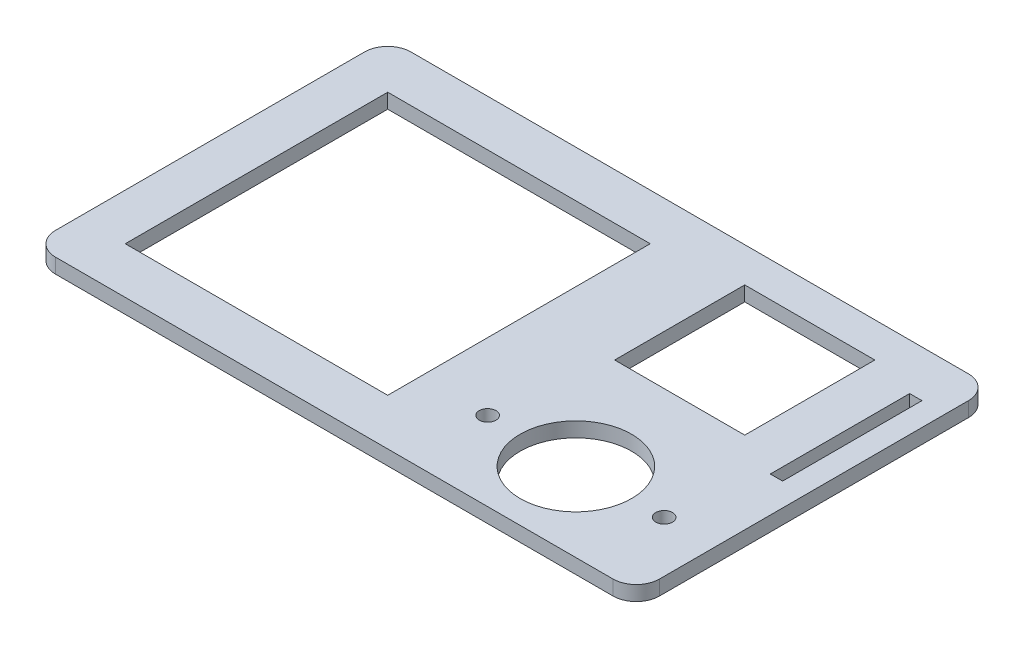
ISO-10303-21;
HEADER;
FILE_DESCRIPTION(('STEP AP214'),'2;1');
FILE_NAME('part.step','',(''),(''),'','','');
FILE_SCHEMA(('AUTOMOTIVE_DESIGN { 1 0 10303 214 1 1 1 1 }'));
ENDSEC;
DATA;
#1=APPLICATION_CONTEXT('core data for automotive mechanical design processes');
#2=APPLICATION_PROTOCOL_DEFINITION('international standard','automotive_design',2000,#1);
#3=PRODUCT_CONTEXT('',#1,'mechanical');
#4=PRODUCT('Part','Part','',(#3));
#5=PRODUCT_RELATED_PRODUCT_CATEGORY('part','',(#4));
#6=PRODUCT_DEFINITION_FORMATION('','',#4);
#7=PRODUCT_DEFINITION_CONTEXT('part definition',#1,'design');
#8=PRODUCT_DEFINITION('design','',#6,#7);
#9=PRODUCT_DEFINITION_SHAPE('','',#8);
#10=(LENGTH_UNIT() NAMED_UNIT(*) SI_UNIT(.MILLI.,.METRE.));
#11=(NAMED_UNIT(*) PLANE_ANGLE_UNIT() SI_UNIT($,.RADIAN.));
#12=(NAMED_UNIT(*) SI_UNIT($,.STERADIAN.) SOLID_ANGLE_UNIT());
#13=UNCERTAINTY_MEASURE_WITH_UNIT(LENGTH_MEASURE(1.E-05),#10,'distance_accuracy_value','');
#14=(GEOMETRIC_REPRESENTATION_CONTEXT(3) GLOBAL_UNCERTAINTY_ASSIGNED_CONTEXT((#13)) GLOBAL_UNIT_ASSIGNED_CONTEXT((#10,
#11,#12)) REPRESENTATION_CONTEXT('',''));
#15=CARTESIAN_POINT('',(0.,0.,0.));
#16=DIRECTION('',(0.,0.,1.));
#17=DIRECTION('',(1.,0.,0.));
#18=AXIS2_PLACEMENT_3D('',#15,#16,#17);
#19=CARTESIAN_POINT('',(0.,3.175,0.));
#20=DIRECTION('',(0.,-1.,0.));
#21=DIRECTION('',(0.,0.,-1.));
#22=AXIS2_PLACEMENT_3D('',#19,#20,#21);
#23=PLANE('',#22);
#24=CARTESIAN_POINT('',(81.,3.175,-17.));
#25=DIRECTION('',(0.,1.,0.));
#26=DIRECTION('',(0.,0.,-1.));
#27=AXIS2_PLACEMENT_3D('',#24,#25,#26);
#28=CIRCLE('',#27,1.79999999999999);
#29=CARTESIAN_POINT('',(81.,3.175,-18.8));
#30=VERTEX_POINT('',#29);
#31=EDGE_CURVE('E234',#30,#30,#28,.T.);
#32=ORIENTED_EDGE('',*,*,#31,.F.);
#33=EDGE_LOOP('',(#32));
#34=FACE_BOUND('',#33,.T.);
#35=CARTESIAN_POINT('',(119.,3.175,-17.));
#36=DIRECTION('',(0.,1.,0.));
#37=DIRECTION('',(0.,0.,1.));
#38=AXIS2_PLACEMENT_3D('',#35,#36,#37);
#39=CIRCLE('',#38,1.79999999999999);
#40=CARTESIAN_POINT('',(119.,3.175,-15.2));
#41=VERTEX_POINT('',#40);
#42=EDGE_CURVE('E242',#41,#41,#39,.T.);
#43=ORIENTED_EDGE('',*,*,#42,.F.);
#44=EDGE_LOOP('',(#43));
#45=FACE_BOUND('',#44,.T.);
#46=CARTESIAN_POINT('',(100.,3.175,-17.));
#47=DIRECTION('',(0.,1.,0.));
#48=DIRECTION('',(0.,0.,1.));
#49=AXIS2_PLACEMENT_3D('',#46,#47,#48);
#50=CIRCLE('',#49,12.);
#51=CARTESIAN_POINT('',(100.,3.175,-5.00000000000002));
#52=VERTEX_POINT('',#51);
#53=EDGE_CURVE('E250',#52,#52,#50,.T.);
#54=ORIENTED_EDGE('',*,*,#53,.F.);
#55=EDGE_LOOP('',(#54));
#56=FACE_BOUND('',#55,.T.);
#57=DIRECTION('',(0.,0.,1.));
#58=VECTOR('',#57,1.);
#59=CARTESIAN_POINT('',(84.35,3.175,-69.));
#60=LINE('',#59,#58);
#61=CARTESIAN_POINT('',(84.35,3.175,-69.));
#62=VERTEX_POINT('',#61);
#63=CARTESIAN_POINT('',(84.35,3.175,-41.));
#64=VERTEX_POINT('',#63);
#65=EDGE_CURVE('E258',#62,#64,#60,.T.);
#66=ORIENTED_EDGE('',*,*,#65,.F.);
#67=DIRECTION('',(-1.,0.,0.));
#68=VECTOR('',#67,1.);
#69=CARTESIAN_POINT('',(84.35,3.175,-69.));
#70=LINE('',#69,#68);
#71=CARTESIAN_POINT('',(112.35,3.175,-69.));
#72=VERTEX_POINT('',#71);
#73=EDGE_CURVE('E269',#72,#62,#70,.T.);
#74=ORIENTED_EDGE('',*,*,#73,.F.);
#75=DIRECTION('',(0.,0.,-1.));
#76=VECTOR('',#75,1.);
#77=CARTESIAN_POINT('',(112.35,3.175,-69.));
#78=LINE('',#77,#76);
#79=CARTESIAN_POINT('',(112.35,3.175,-41.));
#80=VERTEX_POINT('',#79);
#81=EDGE_CURVE('E265',#80,#72,#78,.T.);
#82=ORIENTED_EDGE('',*,*,#81,.F.);
#83=DIRECTION('',(1.,0.,0.));
#84=VECTOR('',#83,1.);
#85=CARTESIAN_POINT('',(84.35,3.175,-41.));
#86=LINE('',#85,#84);
#87=EDGE_CURVE('E261',#64,#80,#86,.T.);
#88=ORIENTED_EDGE('',*,*,#87,.F.);
#89=EDGE_LOOP('',(#66,#74,#82,#88));
#90=FACE_BOUND('',#89,.T.);
#91=DIRECTION('',(-1.,0.,0.));
#92=VECTOR('',#91,1.);
#93=CARTESIAN_POINT('',(0.,3.175,-76.5));
#94=LINE('',#93,#92);
#95=CARTESIAN_POINT('',(125.,3.175,-76.5));
#96=VERTEX_POINT('',#95);
#97=CARTESIAN_POINT('',(5.,3.175,-76.5));
#98=VERTEX_POINT('',#97);
#99=EDGE_CURVE('E355',#96,#98,#94,.T.);
#100=ORIENTED_EDGE('',*,*,#99,.T.);
#101=CARTESIAN_POINT('',(5.,3.175,-71.5));
#102=DIRECTION('',(0.,-1.,0.));
#103=DIRECTION('',(0.,0.,-1.));
#104=AXIS2_PLACEMENT_3D('',#101,#102,#103);
#105=CIRCLE('',#104,5.);
#106=CARTESIAN_POINT('',(0.,3.175,-71.5));
#107=VERTEX_POINT('',#106);
#108=EDGE_CURVE('E406',#98,#107,#105,.F.);
#109=ORIENTED_EDGE('',*,*,#108,.T.);
#110=DIRECTION('',(0.,0.,1.));
#111=VECTOR('',#110,1.);
#112=CARTESIAN_POINT('',(0.,3.175,0.));
#113=LINE('',#112,#111);
#114=CARTESIAN_POINT('',(0.,3.175,-5.));
#115=VERTEX_POINT('',#114);
#116=EDGE_CURVE('E344',#107,#115,#113,.T.);
#117=ORIENTED_EDGE('',*,*,#116,.T.);
#118=CARTESIAN_POINT('',(5.,3.175,-5.));
#119=DIRECTION('',(0.,-1.,0.));
#120=DIRECTION('',(0.,0.,-1.));
#121=AXIS2_PLACEMENT_3D('',#118,#119,#120);
#122=CIRCLE('',#121,5.);
#123=CARTESIAN_POINT('',(5.,3.175,0.));
#124=VERTEX_POINT('',#123);
#125=EDGE_CURVE('E403',#115,#124,#122,.F.);
#126=ORIENTED_EDGE('',*,*,#125,.T.);
#127=DIRECTION('',(1.,0.,0.));
#128=VECTOR('',#127,1.);
#129=CARTESIAN_POINT('',(0.,3.175,0.));
#130=LINE('',#129,#128);
#131=CARTESIAN_POINT('',(125.,3.175,0.));
#132=VERTEX_POINT('',#131);
#133=EDGE_CURVE('E348',#124,#132,#130,.T.);
#134=ORIENTED_EDGE('',*,*,#133,.T.);
#135=CARTESIAN_POINT('',(125.,3.175,-5.));
#136=DIRECTION('',(0.,-1.,0.));
#137=DIRECTION('',(0.,0.,-1.));
#138=AXIS2_PLACEMENT_3D('',#135,#136,#137);
#139=CIRCLE('',#138,5.);
#140=CARTESIAN_POINT('',(130.,3.175,-5.));
#141=VERTEX_POINT('',#140);
#142=EDGE_CURVE('E63',#132,#141,#139,.F.);
#143=ORIENTED_EDGE('',*,*,#142,.T.);
#144=DIRECTION('',(0.,0.,-1.));
#145=VECTOR('',#144,1.);
#146=CARTESIAN_POINT('',(130.,3.175,0.));
#147=LINE('',#146,#145);
#148=CARTESIAN_POINT('',(130.,3.175,-71.5));
#149=VERTEX_POINT('',#148);
#150=EDGE_CURVE('E352',#141,#149,#147,.T.);
#151=ORIENTED_EDGE('',*,*,#150,.T.);
#152=CARTESIAN_POINT('',(125.,3.175,-71.5));
#153=DIRECTION('',(0.,-1.,0.));
#154=DIRECTION('',(0.,0.,-1.));
#155=AXIS2_PLACEMENT_3D('',#152,#153,#154);
#156=CIRCLE('',#155,5.);
#157=EDGE_CURVE('E400',#149,#96,#156,.F.);
#158=ORIENTED_EDGE('',*,*,#157,.T.);
#159=EDGE_LOOP('',(#100,#109,#117,#126,#134,#143,#151,#158));
#160=FACE_BOUND('',#159,.T.);
#161=DIRECTION('',(0.,0.,1.));
#162=VECTOR('',#161,1.);
#163=CARTESIAN_POINT('',(9.99999999999999,3.175,-66.5));
#164=LINE('',#163,#162);
#165=CARTESIAN_POINT('',(9.99999999999999,3.175,-66.5));
#166=VERTEX_POINT('',#165);
#167=CARTESIAN_POINT('',(10.,3.175,-10.));
#168=VERTEX_POINT('',#167);
#169=EDGE_CURVE('E301',#166,#168,#164,.T.);
#170=ORIENTED_EDGE('',*,*,#169,.F.);
#171=DIRECTION('',(-1.,0.,0.));
#172=VECTOR('',#171,1.);
#173=CARTESIAN_POINT('',(9.99999999999999,3.175,-66.5));
#174=LINE('',#173,#172);
#175=CARTESIAN_POINT('',(66.5,3.175,-66.5));
#176=VERTEX_POINT('',#175);
#177=EDGE_CURVE('E312',#176,#166,#174,.T.);
#178=ORIENTED_EDGE('',*,*,#177,.F.);
#179=DIRECTION('',(0.,0.,-1.));
#180=VECTOR('',#179,1.);
#181=CARTESIAN_POINT('',(66.5,3.175,-66.5));
#182=LINE('',#181,#180);
#183=CARTESIAN_POINT('',(66.5,3.175,-10.));
#184=VERTEX_POINT('',#183);
#185=EDGE_CURVE('E308',#184,#176,#182,.T.);
#186=ORIENTED_EDGE('',*,*,#185,.F.);
#187=DIRECTION('',(1.,0.,0.));
#188=VECTOR('',#187,1.);
#189=CARTESIAN_POINT('',(10.,3.175,-10.));
#190=LINE('',#189,#188);
#191=EDGE_CURVE('E304',#168,#184,#190,.T.);
#192=ORIENTED_EDGE('',*,*,#191,.F.);
#193=EDGE_LOOP('',(#170,#178,#186,#192));
#194=FACE_BOUND('',#193,.T.);
#195=DIRECTION('',(0.,0.,-1.));
#196=VECTOR('',#195,1.);
#197=CARTESIAN_POINT('',(125.,3.175,-66.5));
#198=LINE('',#197,#196);
#199=CARTESIAN_POINT('',(125.,3.175,-36.5));
#200=VERTEX_POINT('',#199);
#201=CARTESIAN_POINT('',(125.,3.175,-66.5));
#202=VERTEX_POINT('',#201);
#203=EDGE_CURVE('E181',#200,#202,#198,.T.);
#204=ORIENTED_EDGE('',*,*,#203,.F.);
#205=DIRECTION('',(1.,0.,0.));
#206=VECTOR('',#205,1.);
#207=CARTESIAN_POINT('',(125.,3.175,-36.5));
#208=LINE('',#207,#206);
#209=CARTESIAN_POINT('',(122.35,3.175,-36.5));
#210=VERTEX_POINT('',#209);
#211=EDGE_CURVE('E210',#210,#200,#208,.T.);
#212=ORIENTED_EDGE('',*,*,#211,.F.);
#213=DIRECTION('',(0.,0.,1.));
#214=VECTOR('',#213,1.);
#215=CARTESIAN_POINT('',(122.35,3.175,-66.5));
#216=LINE('',#215,#214);
#217=CARTESIAN_POINT('',(122.35,3.175,-66.5));
#218=VERTEX_POINT('',#217);
#219=EDGE_CURVE('E206',#218,#210,#216,.T.);
#220=ORIENTED_EDGE('',*,*,#219,.F.);
#221=DIRECTION('',(-1.,0.,0.));
#222=VECTOR('',#221,1.);
#223=CARTESIAN_POINT('',(125.,3.175,-66.5));
#224=LINE('',#223,#222);
#225=EDGE_CURVE('E192',#202,#218,#224,.T.);
#226=ORIENTED_EDGE('',*,*,#225,.F.);
#227=EDGE_LOOP('',(#204,#212,#220,#226));
#228=FACE_BOUND('',#227,.T.);
#229=ADVANCED_FACE('F42',(#34,#45,#56,#90,#160,#194,#228),#23,.F.);
#230=CARTESIAN_POINT('',(0.,0.,0.));
#231=DIRECTION('',(0.,-1.,0.));
#232=DIRECTION('',(0.,0.,-1.));
#233=AXIS2_PLACEMENT_3D('',#230,#231,#232);
#234=PLANE('',#233);
#235=CARTESIAN_POINT('',(119.,0.,-17.));
#236=DIRECTION('',(0.,1.,0.));
#237=DIRECTION('',(0.,0.,1.));
#238=AXIS2_PLACEMENT_3D('',#235,#236,#237);
#239=CIRCLE('',#238,1.79999999999999);
#240=CARTESIAN_POINT('',(119.,0.,-15.2));
#241=VERTEX_POINT('',#240);
#242=EDGE_CURVE('E238',#241,#241,#239,.T.);
#243=ORIENTED_EDGE('',*,*,#242,.T.);
#244=EDGE_LOOP('',(#243));
#245=FACE_BOUND('',#244,.T.);
#246=DIRECTION('',(-1.,0.,0.));
#247=VECTOR('',#246,1.);
#248=CARTESIAN_POINT('',(84.35,0.,-69.));
#249=LINE('',#248,#247);
#250=CARTESIAN_POINT('',(112.35,0.,-69.));
#251=VERTEX_POINT('',#250);
#252=CARTESIAN_POINT('',(84.35,0.,-69.));
#253=VERTEX_POINT('',#252);
#254=EDGE_CURVE('E262',#251,#253,#249,.T.);
#255=ORIENTED_EDGE('',*,*,#254,.T.);
#256=DIRECTION('',(0.,0.,1.));
#257=VECTOR('',#256,1.);
#258=CARTESIAN_POINT('',(84.35,0.,-69.));
#259=LINE('',#258,#257);
#260=CARTESIAN_POINT('',(84.35,0.,-41.));
#261=VERTEX_POINT('',#260);
#262=EDGE_CURVE('E254',#253,#261,#259,.T.);
#263=ORIENTED_EDGE('',*,*,#262,.T.);
#264=DIRECTION('',(1.,0.,0.));
#265=VECTOR('',#264,1.);
#266=CARTESIAN_POINT('',(84.35,0.,-41.));
#267=LINE('',#266,#265);
#268=CARTESIAN_POINT('',(112.35,0.,-41.));
#269=VERTEX_POINT('',#268);
#270=EDGE_CURVE('E276',#261,#269,#267,.T.);
#271=ORIENTED_EDGE('',*,*,#270,.T.);
#272=DIRECTION('',(0.,0.,-1.));
#273=VECTOR('',#272,1.);
#274=CARTESIAN_POINT('',(112.35,0.,-69.));
#275=LINE('',#274,#273);
#276=EDGE_CURVE('E280',#269,#251,#275,.T.);
#277=ORIENTED_EDGE('',*,*,#276,.T.);
#278=EDGE_LOOP('',(#255,#263,#271,#277));
#279=FACE_BOUND('',#278,.T.);
#280=DIRECTION('',(-1.,0.,0.));
#281=VECTOR('',#280,1.);
#282=CARTESIAN_POINT('',(9.99999999999999,0.,-66.5));
#283=LINE('',#282,#281);
#284=CARTESIAN_POINT('',(66.5,0.,-66.5));
#285=VERTEX_POINT('',#284);
#286=CARTESIAN_POINT('',(9.99999999999999,0.,-66.5));
#287=VERTEX_POINT('',#286);
#288=EDGE_CURVE('E305',#285,#287,#283,.T.);
#289=ORIENTED_EDGE('',*,*,#288,.T.);
#290=DIRECTION('',(0.,0.,1.));
#291=VECTOR('',#290,1.);
#292=CARTESIAN_POINT('',(9.99999999999999,0.,-66.5));
#293=LINE('',#292,#291);
#294=CARTESIAN_POINT('',(10.,0.,-10.));
#295=VERTEX_POINT('',#294);
#296=EDGE_CURVE('E300',#287,#295,#293,.T.);
#297=ORIENTED_EDGE('',*,*,#296,.T.);
#298=DIRECTION('',(1.,0.,0.));
#299=VECTOR('',#298,1.);
#300=CARTESIAN_POINT('',(10.,0.,-10.));
#301=LINE('',#300,#299);
#302=CARTESIAN_POINT('',(66.5,0.,-10.));
#303=VERTEX_POINT('',#302);
#304=EDGE_CURVE('E319',#295,#303,#301,.T.);
#305=ORIENTED_EDGE('',*,*,#304,.T.);
#306=DIRECTION('',(0.,0.,-1.));
#307=VECTOR('',#306,1.);
#308=CARTESIAN_POINT('',(66.5,0.,-66.5));
#309=LINE('',#308,#307);
#310=EDGE_CURVE('E323',#303,#285,#309,.T.);
#311=ORIENTED_EDGE('',*,*,#310,.T.);
#312=EDGE_LOOP('',(#289,#297,#305,#311));
#313=FACE_BOUND('',#312,.T.);
#314=DIRECTION('',(0.,0.,1.));
#315=VECTOR('',#314,1.);
#316=CARTESIAN_POINT('',(0.,0.,0.));
#317=LINE('',#316,#315);
#318=CARTESIAN_POINT('',(0.,0.,-71.5));
#319=VERTEX_POINT('',#318);
#320=CARTESIAN_POINT('',(0.,0.,-5.));
#321=VERTEX_POINT('',#320);
#322=EDGE_CURVE('E343',#319,#321,#317,.T.);
#323=ORIENTED_EDGE('',*,*,#322,.F.);
#324=CARTESIAN_POINT('',(5.,0.,-71.5));
#325=DIRECTION('',(0.,-1.,0.));
#326=DIRECTION('',(0.,0.,-1.));
#327=AXIS2_PLACEMENT_3D('',#324,#325,#326);
#328=CIRCLE('',#327,5.);
#329=CARTESIAN_POINT('',(5.,0.,-76.5));
#330=VERTEX_POINT('',#329);
#331=EDGE_CURVE('E388',#319,#330,#328,.T.);
#332=ORIENTED_EDGE('',*,*,#331,.T.);
#333=DIRECTION('',(-1.,0.,0.));
#334=VECTOR('',#333,1.);
#335=CARTESIAN_POINT('',(0.,0.,-76.5));
#336=LINE('',#335,#334);
#337=CARTESIAN_POINT('',(125.,0.,-76.5));
#338=VERTEX_POINT('',#337);
#339=EDGE_CURVE('E349',#338,#330,#336,.T.);
#340=ORIENTED_EDGE('',*,*,#339,.F.);
#341=CARTESIAN_POINT('',(125.,0.,-71.5));
#342=DIRECTION('',(0.,-1.,0.));
#343=DIRECTION('',(0.,0.,-1.));
#344=AXIS2_PLACEMENT_3D('',#341,#342,#343);
#345=CIRCLE('',#344,5.);
#346=CARTESIAN_POINT('',(130.,0.,-71.5));
#347=VERTEX_POINT('',#346);
#348=EDGE_CURVE('E382',#338,#347,#345,.T.);
#349=ORIENTED_EDGE('',*,*,#348,.T.);
#350=DIRECTION('',(0.,0.,-1.));
#351=VECTOR('',#350,1.);
#352=CARTESIAN_POINT('',(130.,0.,0.));
#353=LINE('',#352,#351);
#354=CARTESIAN_POINT('',(130.,0.,-5.));
#355=VERTEX_POINT('',#354);
#356=EDGE_CURVE('E367',#355,#347,#353,.T.);
#357=ORIENTED_EDGE('',*,*,#356,.F.);
#358=CARTESIAN_POINT('',(125.,0.,-5.));
#359=DIRECTION('',(0.,-1.,0.));
#360=DIRECTION('',(0.,0.,-1.));
#361=AXIS2_PLACEMENT_3D('',#358,#359,#360);
#362=CIRCLE('',#361,5.);
#363=CARTESIAN_POINT('',(125.,0.,0.));
#364=VERTEX_POINT('',#363);
#365=EDGE_CURVE('E379',#355,#364,#362,.T.);
#366=ORIENTED_EDGE('',*,*,#365,.T.);
#367=DIRECTION('',(1.,0.,0.));
#368=VECTOR('',#367,1.);
#369=CARTESIAN_POINT('',(0.,0.,0.));
#370=LINE('',#369,#368);
#371=CARTESIAN_POINT('',(5.,0.,0.));
#372=VERTEX_POINT('',#371);
#373=EDGE_CURVE('E363',#372,#364,#370,.T.);
#374=ORIENTED_EDGE('',*,*,#373,.F.);
#375=CARTESIAN_POINT('',(5.,0.,-5.));
#376=DIRECTION('',(0.,-1.,0.));
#377=DIRECTION('',(0.,0.,-1.));
#378=AXIS2_PLACEMENT_3D('',#375,#376,#377);
#379=CIRCLE('',#378,5.);
#380=EDGE_CURVE('E385',#372,#321,#379,.T.);
#381=ORIENTED_EDGE('',*,*,#380,.T.);
#382=EDGE_LOOP('',(#323,#332,#340,#349,#357,#366,#374,#381));
#383=FACE_BOUND('',#382,.T.);
#384=CARTESIAN_POINT('',(100.,0.,-17.));
#385=DIRECTION('',(0.,1.,0.));
#386=DIRECTION('',(0.,0.,1.));
#387=AXIS2_PLACEMENT_3D('',#384,#385,#386);
#388=CIRCLE('',#387,12.);
#389=CARTESIAN_POINT('',(100.,0.,-5.00000000000002));
#390=VERTEX_POINT('',#389);
#391=EDGE_CURVE('E246',#390,#390,#388,.T.);
#392=ORIENTED_EDGE('',*,*,#391,.T.);
#393=EDGE_LOOP('',(#392));
#394=FACE_BOUND('',#393,.T.);
#395=CARTESIAN_POINT('',(81.,0.,-17.));
#396=DIRECTION('',(0.,1.,0.));
#397=DIRECTION('',(0.,0.,-1.));
#398=AXIS2_PLACEMENT_3D('',#395,#396,#397);
#399=CIRCLE('',#398,1.79999999999999);
#400=CARTESIAN_POINT('',(81.,0.,-18.8));
#401=VERTEX_POINT('',#400);
#402=EDGE_CURVE('E201',#401,#401,#399,.T.);
#403=ORIENTED_EDGE('',*,*,#402,.T.);
#404=EDGE_LOOP('',(#403));
#405=FACE_BOUND('',#404,.T.);
#406=DIRECTION('',(1.,0.,0.));
#407=VECTOR('',#406,1.);
#408=CARTESIAN_POINT('',(125.,0.,-36.5));
#409=LINE('',#408,#407);
#410=CARTESIAN_POINT('',(122.35,0.,-36.5));
#411=VERTEX_POINT('',#410);
#412=CARTESIAN_POINT('',(125.,0.,-36.5));
#413=VERTEX_POINT('',#412);
#414=EDGE_CURVE('E193',#411,#413,#409,.T.);
#415=ORIENTED_EDGE('',*,*,#414,.T.);
#416=DIRECTION('',(0.,0.,-1.));
#417=VECTOR('',#416,1.);
#418=CARTESIAN_POINT('',(125.,0.,-66.5));
#419=LINE('',#418,#417);
#420=CARTESIAN_POINT('',(125.,0.,-66.5));
#421=VERTEX_POINT('',#420);
#422=EDGE_CURVE('E215',#413,#421,#419,.T.);
#423=ORIENTED_EDGE('',*,*,#422,.T.);
#424=DIRECTION('',(-1.,0.,0.));
#425=VECTOR('',#424,1.);
#426=CARTESIAN_POINT('',(125.,0.,-66.5));
#427=LINE('',#426,#425);
#428=CARTESIAN_POINT('',(122.35,0.,-66.5));
#429=VERTEX_POINT('',#428);
#430=EDGE_CURVE('E199',#421,#429,#427,.T.);
#431=ORIENTED_EDGE('',*,*,#430,.T.);
#432=DIRECTION('',(0.,0.,1.));
#433=VECTOR('',#432,1.);
#434=CARTESIAN_POINT('',(122.35,0.,-66.5));
#435=LINE('',#434,#433);
#436=EDGE_CURVE('E220',#429,#411,#435,.T.);
#437=ORIENTED_EDGE('',*,*,#436,.T.);
#438=EDGE_LOOP('',(#415,#423,#431,#437));
#439=FACE_BOUND('',#438,.T.);
#440=ADVANCED_FACE('F423',(#245,#279,#313,#383,#394,#405,#439),#234,.T.);
#441=CARTESIAN_POINT('',(0.,3.175,0.));
#442=DIRECTION('',(1.,0.,0.));
#443=DIRECTION('',(0.,0.,-1.));
#444=AXIS2_PLACEMENT_3D('',#441,#442,#443);
#445=PLANE('',#444);
#446=ORIENTED_EDGE('',*,*,#116,.F.);
#447=DIRECTION('',(0.,-1.,0.));
#448=VECTOR('',#447,1.);
#449=CARTESIAN_POINT('',(0.,3.175,-71.5));
#450=LINE('',#449,#448);
#451=EDGE_CURVE('E375',#107,#319,#450,.T.);
#452=ORIENTED_EDGE('',*,*,#451,.T.);
#453=ORIENTED_EDGE('',*,*,#322,.T.);
#454=DIRECTION('',(0.,-1.,0.));
#455=VECTOR('',#454,1.);
#456=CARTESIAN_POINT('',(0.,3.175,-5.));
#457=LINE('',#456,#455);
#458=EDGE_CURVE('E359',#321,#115,#457,.F.);
#459=ORIENTED_EDGE('',*,*,#458,.T.);
#460=EDGE_LOOP('',(#446,#452,#453,#459));
#461=FACE_BOUND('',#460,.T.);
#462=ADVANCED_FACE('F442',(#461),#445,.F.);
#463=CARTESIAN_POINT('',(0.,3.175,0.));
#464=DIRECTION('',(0.,0.,-1.));
#465=DIRECTION('',(-1.,0.,0.));
#466=AXIS2_PLACEMENT_3D('',#463,#464,#465);
#467=PLANE('',#466);
#468=ORIENTED_EDGE('',*,*,#133,.F.);
#469=DIRECTION('',(0.,-1.,0.));
#470=VECTOR('',#469,1.);
#471=CARTESIAN_POINT('',(5.,3.175,0.));
#472=LINE('',#471,#470);
#473=EDGE_CURVE('E412',#124,#372,#472,.T.);
#474=ORIENTED_EDGE('',*,*,#473,.T.);
#475=ORIENTED_EDGE('',*,*,#373,.T.);
#476=DIRECTION('',(0.,-1.,0.));
#477=VECTOR('',#476,1.);
#478=CARTESIAN_POINT('',(125.,3.175,0.));
#479=LINE('',#478,#477);
#480=EDGE_CURVE('E409',#364,#132,#479,.F.);
#481=ORIENTED_EDGE('',*,*,#480,.T.);
#482=EDGE_LOOP('',(#468,#474,#475,#481));
#483=FACE_BOUND('',#482,.T.);
#484=ADVANCED_FACE('F450',(#483),#467,.F.);
#485=CARTESIAN_POINT('',(130.,3.175,0.));
#486=DIRECTION('',(-1.,0.,0.));
#487=DIRECTION('',(0.,0.,1.));
#488=AXIS2_PLACEMENT_3D('',#485,#486,#487);
#489=PLANE('',#488);
#490=ORIENTED_EDGE('',*,*,#356,.T.);
#491=DIRECTION('',(0.,-1.,0.));
#492=VECTOR('',#491,1.);
#493=CARTESIAN_POINT('',(130.,3.175,-71.5));
#494=LINE('',#493,#492);
#495=EDGE_CURVE('E11',#347,#149,#494,.F.);
#496=ORIENTED_EDGE('',*,*,#495,.T.);
#497=ORIENTED_EDGE('',*,*,#150,.F.);
#498=DIRECTION('',(0.,-1.,0.));
#499=VECTOR('',#498,1.);
#500=CARTESIAN_POINT('',(130.,3.175,-5.));
#501=LINE('',#500,#499);
#502=EDGE_CURVE('E51',#141,#355,#501,.T.);
#503=ORIENTED_EDGE('',*,*,#502,.T.);
#504=EDGE_LOOP('',(#490,#496,#497,#503));
#505=FACE_BOUND('',#504,.T.);
#506=ADVANCED_FACE('F419',(#505),#489,.F.);
#507=CARTESIAN_POINT('',(0.,3.175,-76.5));
#508=DIRECTION('',(0.,0.,1.));
#509=DIRECTION('',(1.,0.,0.));
#510=AXIS2_PLACEMENT_3D('',#507,#508,#509);
#511=PLANE('',#510);
#512=ORIENTED_EDGE('',*,*,#339,.T.);
#513=DIRECTION('',(0.,-1.,0.));
#514=VECTOR('',#513,1.);
#515=CARTESIAN_POINT('',(5.,3.175,-76.5));
#516=LINE('',#515,#514);
#517=EDGE_CURVE('E395',#330,#98,#516,.F.);
#518=ORIENTED_EDGE('',*,*,#517,.T.);
#519=ORIENTED_EDGE('',*,*,#99,.F.);
#520=DIRECTION('',(0.,-1.,0.));
#521=VECTOR('',#520,1.);
#522=CARTESIAN_POINT('',(125.,3.175,-76.5));
#523=LINE('',#522,#521);
#524=EDGE_CURVE('E391',#96,#338,#523,.T.);
#525=ORIENTED_EDGE('',*,*,#524,.T.);
#526=EDGE_LOOP('',(#512,#518,#519,#525));
#527=FACE_BOUND('',#526,.T.);
#528=ADVANCED_FACE('F433',(#527),#511,.F.);
#529=CARTESIAN_POINT('',(9.99999999999999,3.175,-66.5));
#530=DIRECTION('',(1.,0.,0.));
#531=DIRECTION('',(0.,0.,-1.));
#532=AXIS2_PLACEMENT_3D('',#529,#530,#531);
#533=PLANE('',#532);
#534=ORIENTED_EDGE('',*,*,#296,.F.);
#535=DIRECTION('',(0.,-1.,0.));
#536=VECTOR('',#535,1.);
#537=CARTESIAN_POINT('',(9.99999999999999,3.175,-66.5));
#538=LINE('',#537,#536);
#539=EDGE_CURVE('E315',#166,#287,#538,.T.);
#540=ORIENTED_EDGE('',*,*,#539,.F.);
#541=ORIENTED_EDGE('',*,*,#169,.T.);
#542=DIRECTION('',(0.,-1.,0.));
#543=VECTOR('',#542,1.);
#544=CARTESIAN_POINT('',(10.,3.175,-10.));
#545=LINE('',#544,#543);
#546=EDGE_CURVE('E339',#168,#295,#545,.T.);
#547=ORIENTED_EDGE('',*,*,#546,.T.);
#548=EDGE_LOOP('',(#534,#540,#541,#547));
#549=FACE_BOUND('',#548,.T.);
#550=ADVANCED_FACE('F467',(#549),#533,.T.);
#551=CARTESIAN_POINT('',(10.,3.175,-10.));
#552=DIRECTION('',(0.,0.,-1.));
#553=DIRECTION('',(-1.,0.,0.));
#554=AXIS2_PLACEMENT_3D('',#551,#552,#553);
#555=PLANE('',#554);
#556=ORIENTED_EDGE('',*,*,#304,.F.);
#557=ORIENTED_EDGE('',*,*,#546,.F.);
#558=ORIENTED_EDGE('',*,*,#191,.T.);
#559=DIRECTION('',(0.,-1.,0.));
#560=VECTOR('',#559,1.);
#561=CARTESIAN_POINT('',(66.5,3.175,-10.));
#562=LINE('',#561,#560);
#563=EDGE_CURVE('E336',#184,#303,#562,.T.);
#564=ORIENTED_EDGE('',*,*,#563,.T.);
#565=EDGE_LOOP('',(#556,#557,#558,#564));
#566=FACE_BOUND('',#565,.T.);
#567=ADVANCED_FACE('F632',(#566),#555,.T.);
#568=CARTESIAN_POINT('',(66.5,3.175,-66.5));
#569=DIRECTION('',(-1.,0.,0.));
#570=DIRECTION('',(0.,0.,1.));
#571=AXIS2_PLACEMENT_3D('',#568,#569,#570);
#572=PLANE('',#571);
#573=ORIENTED_EDGE('',*,*,#310,.F.);
#574=ORIENTED_EDGE('',*,*,#563,.F.);
#575=ORIENTED_EDGE('',*,*,#185,.T.);
#576=DIRECTION('',(0.,-1.,0.));
#577=VECTOR('',#576,1.);
#578=CARTESIAN_POINT('',(66.5,3.175,-66.5));
#579=LINE('',#578,#577);
#580=EDGE_CURVE('E333',#176,#285,#579,.T.);
#581=ORIENTED_EDGE('',*,*,#580,.T.);
#582=EDGE_LOOP('',(#573,#574,#575,#581));
#583=FACE_BOUND('',#582,.T.);
#584=ADVANCED_FACE('F622',(#583),#572,.T.);
#585=CARTESIAN_POINT('',(9.99999999999999,3.175,-66.5));
#586=DIRECTION('',(0.,0.,1.));
#587=DIRECTION('',(1.,0.,0.));
#588=AXIS2_PLACEMENT_3D('',#585,#586,#587);
#589=PLANE('',#588);
#590=ORIENTED_EDGE('',*,*,#288,.F.);
#591=ORIENTED_EDGE('',*,*,#580,.F.);
#592=ORIENTED_EDGE('',*,*,#177,.T.);
#593=ORIENTED_EDGE('',*,*,#539,.T.);
#594=EDGE_LOOP('',(#590,#591,#592,#593));
#595=FACE_BOUND('',#594,.T.);
#596=ADVANCED_FACE('F612',(#595),#589,.T.);
#597=CARTESIAN_POINT('',(84.35,3.175,-69.));
#598=DIRECTION('',(1.,0.,0.));
#599=DIRECTION('',(0.,0.,-1.));
#600=AXIS2_PLACEMENT_3D('',#597,#598,#599);
#601=PLANE('',#600);
#602=ORIENTED_EDGE('',*,*,#262,.F.);
#603=DIRECTION('',(0.,-1.,0.));
#604=VECTOR('',#603,1.);
#605=CARTESIAN_POINT('',(84.35,3.175,-69.));
#606=LINE('',#605,#604);
#607=EDGE_CURVE('E272',#62,#253,#606,.T.);
#608=ORIENTED_EDGE('',*,*,#607,.F.);
#609=ORIENTED_EDGE('',*,*,#65,.T.);
#610=DIRECTION('',(0.,-1.,0.));
#611=VECTOR('',#610,1.);
#612=CARTESIAN_POINT('',(84.35,3.175,-41.));
#613=LINE('',#612,#611);
#614=EDGE_CURVE('E296',#64,#261,#613,.T.);
#615=ORIENTED_EDGE('',*,*,#614,.T.);
#616=EDGE_LOOP('',(#602,#608,#609,#615));
#617=FACE_BOUND('',#616,.T.);
#618=ADVANCED_FACE('F602',(#617),#601,.T.);
#619=CARTESIAN_POINT('',(84.35,3.175,-41.));
#620=DIRECTION('',(0.,0.,-1.));
#621=DIRECTION('',(-1.,0.,0.));
#622=AXIS2_PLACEMENT_3D('',#619,#620,#621);
#623=PLANE('',#622);
#624=ORIENTED_EDGE('',*,*,#270,.F.);
#625=ORIENTED_EDGE('',*,*,#614,.F.);
#626=ORIENTED_EDGE('',*,*,#87,.T.);
#627=DIRECTION('',(0.,-1.,0.));
#628=VECTOR('',#627,1.);
#629=CARTESIAN_POINT('',(112.35,3.175,-41.));
#630=LINE('',#629,#628);
#631=EDGE_CURVE('E293',#80,#269,#630,.T.);
#632=ORIENTED_EDGE('',*,*,#631,.T.);
#633=EDGE_LOOP('',(#624,#625,#626,#632));
#634=FACE_BOUND('',#633,.T.);
#635=ADVANCED_FACE('F592',(#634),#623,.T.);
#636=CARTESIAN_POINT('',(112.35,3.175,-69.));
#637=DIRECTION('',(-1.,0.,0.));
#638=DIRECTION('',(0.,0.,1.));
#639=AXIS2_PLACEMENT_3D('',#636,#637,#638);
#640=PLANE('',#639);
#641=ORIENTED_EDGE('',*,*,#276,.F.);
#642=ORIENTED_EDGE('',*,*,#631,.F.);
#643=ORIENTED_EDGE('',*,*,#81,.T.);
#644=DIRECTION('',(0.,-1.,0.));
#645=VECTOR('',#644,1.);
#646=CARTESIAN_POINT('',(112.35,3.175,-69.));
#647=LINE('',#646,#645);
#648=EDGE_CURVE('E290',#72,#251,#647,.T.);
#649=ORIENTED_EDGE('',*,*,#648,.T.);
#650=EDGE_LOOP('',(#641,#642,#643,#649));
#651=FACE_BOUND('',#650,.T.);
#652=ADVANCED_FACE('F582',(#651),#640,.T.);
#653=CARTESIAN_POINT('',(84.35,3.175,-69.));
#654=DIRECTION('',(0.,0.,1.));
#655=DIRECTION('',(1.,0.,0.));
#656=AXIS2_PLACEMENT_3D('',#653,#654,#655);
#657=PLANE('',#656);
#658=ORIENTED_EDGE('',*,*,#254,.F.);
#659=ORIENTED_EDGE('',*,*,#648,.F.);
#660=ORIENTED_EDGE('',*,*,#73,.T.);
#661=ORIENTED_EDGE('',*,*,#607,.T.);
#662=EDGE_LOOP('',(#658,#659,#660,#661));
#663=FACE_BOUND('',#662,.T.);
#664=ADVANCED_FACE('F572',(#663),#657,.T.);
#665=CARTESIAN_POINT('',(100.,3.175,-17.));
#666=DIRECTION('',(0.,-1.,0.));
#667=DIRECTION('',(0.,0.,-1.));
#668=AXIS2_PLACEMENT_3D('',#665,#666,#667);
#669=CYLINDRICAL_SURFACE('',#668,12.);
#670=ORIENTED_EDGE('',*,*,#53,.T.);
#671=EDGE_LOOP('',(#670));
#672=FACE_BOUND('',#671,.T.);
#673=ORIENTED_EDGE('',*,*,#391,.F.);
#674=EDGE_LOOP('',(#673));
#675=FACE_BOUND('',#674,.T.);
#676=ADVANCED_FACE('F562',(#672,#675),#669,.F.);
#677=CARTESIAN_POINT('',(119.,3.175,-17.));
#678=DIRECTION('',(0.,-1.,0.));
#679=DIRECTION('',(0.,0.,-1.));
#680=AXIS2_PLACEMENT_3D('',#677,#678,#679);
#681=CYLINDRICAL_SURFACE('',#680,1.79999999999999);
#682=ORIENTED_EDGE('',*,*,#42,.T.);
#683=EDGE_LOOP('',(#682));
#684=FACE_BOUND('',#683,.T.);
#685=ORIENTED_EDGE('',*,*,#242,.F.);
#686=EDGE_LOOP('',(#685));
#687=FACE_BOUND('',#686,.T.);
#688=ADVANCED_FACE('F552',(#684,#687),#681,.F.);
#689=CARTESIAN_POINT('',(81.,3.175,-17.));
#690=DIRECTION('',(0.,-1.,0.));
#691=DIRECTION('',(0.,0.,-1.));
#692=AXIS2_PLACEMENT_3D('',#689,#690,#691);
#693=CYLINDRICAL_SURFACE('',#692,1.79999999999999);
#694=ORIENTED_EDGE('',*,*,#31,.T.);
#695=EDGE_LOOP('',(#694));
#696=FACE_BOUND('',#695,.T.);
#697=ORIENTED_EDGE('',*,*,#402,.F.);
#698=EDGE_LOOP('',(#697));
#699=FACE_BOUND('',#698,.T.);
#700=ADVANCED_FACE('F543',(#696,#699),#693,.F.);
#701=CARTESIAN_POINT('',(125.,3.175,-66.5));
#702=DIRECTION('',(-1.,0.,0.));
#703=DIRECTION('',(0.,0.,1.));
#704=AXIS2_PLACEMENT_3D('',#701,#702,#703);
#705=PLANE('',#704);
#706=ORIENTED_EDGE('',*,*,#422,.F.);
#707=DIRECTION('',(0.,-1.,0.));
#708=VECTOR('',#707,1.);
#709=CARTESIAN_POINT('',(125.,3.175,-36.5));
#710=LINE('',#709,#708);
#711=EDGE_CURVE('E187',#200,#413,#710,.T.);
#712=ORIENTED_EDGE('',*,*,#711,.F.);
#713=ORIENTED_EDGE('',*,*,#203,.T.);
#714=DIRECTION('',(0.,-1.,0.));
#715=VECTOR('',#714,1.);
#716=CARTESIAN_POINT('',(125.,3.175,-66.5));
#717=LINE('',#716,#715);
#718=EDGE_CURVE('E184',#202,#421,#717,.T.);
#719=ORIENTED_EDGE('',*,*,#718,.T.);
#720=EDGE_LOOP('',(#706,#712,#713,#719));
#721=FACE_BOUND('',#720,.T.);
#722=ADVANCED_FACE('F183',(#721),#705,.T.);
#723=CARTESIAN_POINT('',(125.,3.175,-66.5));
#724=DIRECTION('',(0.,0.,1.));
#725=DIRECTION('',(1.,0.,0.));
#726=AXIS2_PLACEMENT_3D('',#723,#724,#725);
#727=PLANE('',#726);
#728=ORIENTED_EDGE('',*,*,#430,.F.);
#729=ORIENTED_EDGE('',*,*,#718,.F.);
#730=ORIENTED_EDGE('',*,*,#225,.T.);
#731=DIRECTION('',(0.,-1.,0.));
#732=VECTOR('',#731,1.);
#733=CARTESIAN_POINT('',(122.35,3.175,-66.5));
#734=LINE('',#733,#732);
#735=EDGE_CURVE('E202',#218,#429,#734,.T.);
#736=ORIENTED_EDGE('',*,*,#735,.T.);
#737=EDGE_LOOP('',(#728,#729,#730,#736));
#738=FACE_BOUND('',#737,.T.);
#739=ADVANCED_FACE('F196',(#738),#727,.T.);
#740=CARTESIAN_POINT('',(122.35,3.175,-66.5));
#741=DIRECTION('',(1.,0.,0.));
#742=DIRECTION('',(0.,0.,-1.));
#743=AXIS2_PLACEMENT_3D('',#740,#741,#742);
#744=PLANE('',#743);
#745=ORIENTED_EDGE('',*,*,#436,.F.);
#746=ORIENTED_EDGE('',*,*,#735,.F.);
#747=ORIENTED_EDGE('',*,*,#219,.T.);
#748=DIRECTION('',(0.,-1.,0.));
#749=VECTOR('',#748,1.);
#750=CARTESIAN_POINT('',(122.35,3.175,-36.5));
#751=LINE('',#750,#749);
#752=EDGE_CURVE('E229',#210,#411,#751,.T.);
#753=ORIENTED_EDGE('',*,*,#752,.T.);
#754=EDGE_LOOP('',(#745,#746,#747,#753));
#755=FACE_BOUND('',#754,.T.);
#756=ADVANCED_FACE('F516',(#755),#744,.T.);
#757=CARTESIAN_POINT('',(125.,3.175,-36.5));
#758=DIRECTION('',(0.,0.,-1.));
#759=DIRECTION('',(-1.,0.,0.));
#760=AXIS2_PLACEMENT_3D('',#757,#758,#759);
#761=PLANE('',#760);
#762=ORIENTED_EDGE('',*,*,#414,.F.);
#763=ORIENTED_EDGE('',*,*,#752,.F.);
#764=ORIENTED_EDGE('',*,*,#211,.T.);
#765=ORIENTED_EDGE('',*,*,#711,.T.);
#766=EDGE_LOOP('',(#762,#763,#764,#765));
#767=FACE_BOUND('',#766,.T.);
#768=ADVANCED_FACE('F480',(#767),#761,.T.);
#769=CARTESIAN_POINT('',(5.,3.175,-71.5));
#770=DIRECTION('',(0.,-1.,0.));
#771=DIRECTION('',(0.,0.,-1.));
#772=AXIS2_PLACEMENT_3D('',#769,#770,#771);
#773=CYLINDRICAL_SURFACE('',#772,5.);
#774=ORIENTED_EDGE('',*,*,#108,.F.);
#775=ORIENTED_EDGE('',*,*,#517,.F.);
#776=ORIENTED_EDGE('',*,*,#331,.F.);
#777=ORIENTED_EDGE('',*,*,#451,.F.);
#778=EDGE_LOOP('',(#774,#775,#776,#777));
#779=FACE_BOUND('',#778,.T.);
#780=ADVANCED_FACE('F440',(#779),#773,.T.);
#781=CARTESIAN_POINT('',(5.,3.175,-5.));
#782=DIRECTION('',(0.,-1.,0.));
#783=DIRECTION('',(0.,0.,-1.));
#784=AXIS2_PLACEMENT_3D('',#781,#782,#783);
#785=CYLINDRICAL_SURFACE('',#784,5.);
#786=ORIENTED_EDGE('',*,*,#125,.F.);
#787=ORIENTED_EDGE('',*,*,#458,.F.);
#788=ORIENTED_EDGE('',*,*,#380,.F.);
#789=ORIENTED_EDGE('',*,*,#473,.F.);
#790=EDGE_LOOP('',(#786,#787,#788,#789));
#791=FACE_BOUND('',#790,.T.);
#792=ADVANCED_FACE('F447',(#791),#785,.T.);
#793=CARTESIAN_POINT('',(125.,3.175,-71.5));
#794=DIRECTION('',(0.,-1.,0.));
#795=DIRECTION('',(0.,0.,-1.));
#796=AXIS2_PLACEMENT_3D('',#793,#794,#795);
#797=CYLINDRICAL_SURFACE('',#796,5.);
#798=ORIENTED_EDGE('',*,*,#157,.F.);
#799=ORIENTED_EDGE('',*,*,#495,.F.);
#800=ORIENTED_EDGE('',*,*,#348,.F.);
#801=ORIENTED_EDGE('',*,*,#524,.F.);
#802=EDGE_LOOP('',(#798,#799,#800,#801));
#803=FACE_BOUND('',#802,.T.);
#804=ADVANCED_FACE('F430',(#803),#797,.T.);
#805=CARTESIAN_POINT('',(125.,3.175,-5.));
#806=DIRECTION('',(0.,-1.,0.));
#807=DIRECTION('',(0.,0.,-1.));
#808=AXIS2_PLACEMENT_3D('',#805,#806,#807);
#809=CYLINDRICAL_SURFACE('',#808,5.);
#810=ORIENTED_EDGE('',*,*,#142,.F.);
#811=ORIENTED_EDGE('',*,*,#480,.F.);
#812=ORIENTED_EDGE('',*,*,#365,.F.);
#813=ORIENTED_EDGE('',*,*,#502,.F.);
#814=EDGE_LOOP('',(#810,#811,#812,#813));
#815=FACE_BOUND('',#814,.T.);
#816=ADVANCED_FACE('F44',(#815),#809,.T.);
#817=CLOSED_SHELL('',(#229,#440,#462,#484,#506,#528,#550,#567,#584,#596,#618,#635,#652,#664,
#676,#688,#700,#722,#739,#756,#768,#780,#792,#804,#816));
#818=MANIFOLD_SOLID_BREP('B2',#817);
#819=ADVANCED_BREP_SHAPE_REPRESENTATION('',(#18,#818),#14);
#820=SHAPE_DEFINITION_REPRESENTATION(#9,#819);
ENDSEC;
END-ISO-10303-21;
